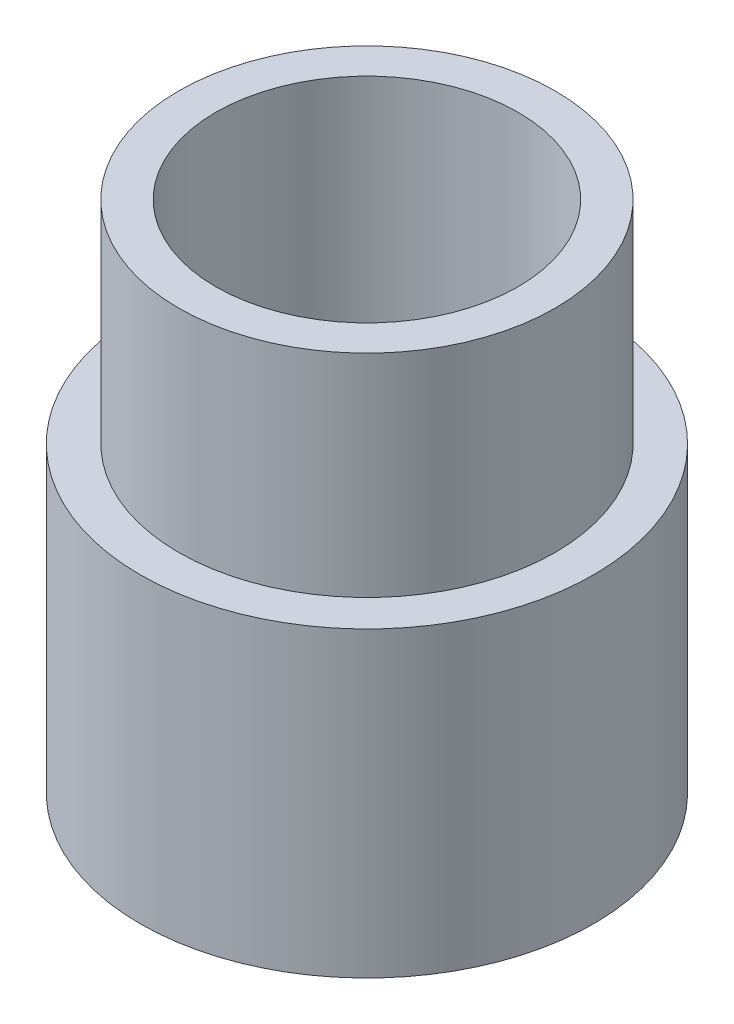
ISO-10303-21;
HEADER;
FILE_DESCRIPTION(('STEP AP214'),'2;1');
FILE_NAME('part.step','',(''),(''),'','','');
FILE_SCHEMA(('AUTOMOTIVE_DESIGN { 1 0 10303 214 1 1 1 1 }'));
ENDSEC;
DATA;
#1=APPLICATION_CONTEXT('core data for automotive mechanical design processes');
#2=APPLICATION_PROTOCOL_DEFINITION('international standard','automotive_design',2000,#1);
#3=PRODUCT_CONTEXT('',#1,'mechanical');
#4=PRODUCT('Part','Part','',(#3));
#5=PRODUCT_RELATED_PRODUCT_CATEGORY('part','',(#4));
#6=PRODUCT_DEFINITION_FORMATION('','',#4);
#7=PRODUCT_DEFINITION_CONTEXT('part definition',#1,'design');
#8=PRODUCT_DEFINITION('design','',#6,#7);
#9=PRODUCT_DEFINITION_SHAPE('','',#8);
#10=(LENGTH_UNIT() NAMED_UNIT(*) SI_UNIT(.MILLI.,.METRE.));
#11=(NAMED_UNIT(*) PLANE_ANGLE_UNIT() SI_UNIT($,.RADIAN.));
#12=(NAMED_UNIT(*) SI_UNIT($,.STERADIAN.) SOLID_ANGLE_UNIT());
#13=UNCERTAINTY_MEASURE_WITH_UNIT(LENGTH_MEASURE(1.E-05),#10,'distance_accuracy_value','');
#14=(GEOMETRIC_REPRESENTATION_CONTEXT(3) GLOBAL_UNCERTAINTY_ASSIGNED_CONTEXT((#13)) GLOBAL_UNIT_ASSIGNED_CONTEXT((#10,
#11,#12)) REPRESENTATION_CONTEXT('',''));
#15=CARTESIAN_POINT('',(0.,0.,0.));
#16=DIRECTION('',(0.,0.,1.));
#17=DIRECTION('',(1.,0.,0.));
#18=AXIS2_PLACEMENT_3D('',#15,#16,#17);
#19=CARTESIAN_POINT('',(0.,10.,0.));
#20=DIRECTION('',(0.,-1.,0.));
#21=DIRECTION('',(0.,0.,-1.));
#22=AXIS2_PLACEMENT_3D('',#19,#20,#21);
#23=CYLINDRICAL_SURFACE('',#22,7.5);
#24=CARTESIAN_POINT('',(0.,10.,0.));
#25=DIRECTION('',(0.,1.,0.));
#26=DIRECTION('',(0.,0.,1.));
#27=AXIS2_PLACEMENT_3D('',#24,#25,#26);
#28=CIRCLE('',#27,7.5);
#29=CARTESIAN_POINT('',(0.,10.,7.5));
#30=VERTEX_POINT('',#29);
#31=EDGE_CURVE('E38',#30,#30,#28,.T.);
#32=ORIENTED_EDGE('',*,*,#31,.F.);
#33=EDGE_LOOP('',(#32));
#34=FACE_BOUND('',#33,.T.);
#35=CARTESIAN_POINT('',(0.,0.,0.));
#36=DIRECTION('',(0.,1.,0.));
#37=DIRECTION('',(0.,0.,1.));
#38=AXIS2_PLACEMENT_3D('',#35,#36,#37);
#39=CIRCLE('',#38,7.5);
#40=CARTESIAN_POINT('',(0.,0.,7.5));
#41=VERTEX_POINT('',#40);
#42=EDGE_CURVE('E34',#41,#41,#39,.T.);
#43=ORIENTED_EDGE('',*,*,#42,.T.);
#44=EDGE_LOOP('',(#43));
#45=FACE_BOUND('',#44,.T.);
#46=ADVANCED_FACE('F31',(#34,#45),#23,.T.);
#47=CARTESIAN_POINT('',(0.,10.,0.));
#48=DIRECTION('',(0.,1.,0.));
#49=DIRECTION('',(0.,0.,1.));
#50=AXIS2_PLACEMENT_3D('',#47,#48,#49);
#51=PLANE('',#50);
#52=CARTESIAN_POINT('',(0.,10.,0.));
#53=DIRECTION('',(0.,1.,0.));
#54=DIRECTION('',(0.,0.,1.));
#55=AXIS2_PLACEMENT_3D('',#52,#53,#54);
#56=CIRCLE('',#55,6.225);
#57=CARTESIAN_POINT('',(0.,10.,6.225));
#58=VERTEX_POINT('',#57);
#59=EDGE_CURVE('E10',#58,#58,#56,.T.);
#60=ORIENTED_EDGE('',*,*,#59,.F.);
#61=EDGE_LOOP('',(#60));
#62=FACE_BOUND('',#61,.T.);
#63=ORIENTED_EDGE('',*,*,#31,.T.);
#64=EDGE_LOOP('',(#63));
#65=FACE_BOUND('',#64,.T.);
#66=ADVANCED_FACE('F81',(#62,#65),#51,.T.);
#67=CARTESIAN_POINT('',(0.,0.,0.));
#68=DIRECTION('',(0.,1.,0.));
#69=DIRECTION('',(0.,0.,1.));
#70=AXIS2_PLACEMENT_3D('',#67,#68,#69);
#71=PLANE('',#70);
#72=CARTESIAN_POINT('',(0.,0.,0.));
#73=DIRECTION('',(0.,-1.,0.));
#74=DIRECTION('',(0.,0.,-1.));
#75=AXIS2_PLACEMENT_3D('',#72,#73,#74);
#76=CIRCLE('',#75,6.25);
#77=CARTESIAN_POINT('',(0.,0.,-6.25));
#78=VERTEX_POINT('',#77);
#79=EDGE_CURVE('E50',#78,#78,#76,.T.);
#80=ORIENTED_EDGE('',*,*,#79,.F.);
#81=EDGE_LOOP('',(#80));
#82=FACE_BOUND('',#81,.T.);
#83=ORIENTED_EDGE('',*,*,#42,.F.);
#84=EDGE_LOOP('',(#83));
#85=FACE_BOUND('',#84,.T.);
#86=ADVANCED_FACE('F86',(#82,#85),#71,.F.);
#87=CARTESIAN_POINT('',(0.,7.5,0.));
#88=DIRECTION('',(0.,-1.,0.));
#89=DIRECTION('',(0.,0.,-1.));
#90=AXIS2_PLACEMENT_3D('',#87,#88,#89);
#91=CYLINDRICAL_SURFACE('',#90,6.25);
#92=CARTESIAN_POINT('',(0.,7.5,0.));
#93=DIRECTION('',(0.,-1.,0.));
#94=DIRECTION('',(0.,0.,-1.));
#95=AXIS2_PLACEMENT_3D('',#92,#93,#94);
#96=CIRCLE('',#95,6.25);
#97=CARTESIAN_POINT('',(0.,7.5,-6.25));
#98=VERTEX_POINT('',#97);
#99=EDGE_CURVE('E47',#98,#98,#96,.T.);
#100=ORIENTED_EDGE('',*,*,#99,.F.);
#101=EDGE_LOOP('',(#100));
#102=FACE_BOUND('',#101,.T.);
#103=ORIENTED_EDGE('',*,*,#79,.T.);
#104=EDGE_LOOP('',(#103));
#105=FACE_BOUND('',#104,.T.);
#106=ADVANCED_FACE('F95',(#102,#105),#91,.F.);
#107=CARTESIAN_POINT('',(0.,7.5,0.));
#108=DIRECTION('',(0.,-1.,0.));
#109=DIRECTION('',(0.,0.,-1.));
#110=AXIS2_PLACEMENT_3D('',#107,#108,#109);
#111=PLANE('',#110);
#112=CARTESIAN_POINT('',(0.,7.5,0.));
#113=DIRECTION('',(0.,-1.,0.));
#114=DIRECTION('',(0.,0.,-1.));
#115=AXIS2_PLACEMENT_3D('',#112,#113,#114);
#116=CIRCLE('',#115,5.);
#117=CARTESIAN_POINT('',(0.,7.5,5.));
#118=VERTEX_POINT('',#117);
#119=EDGE_CURVE('E55',#118,#118,#116,.T.);
#120=ORIENTED_EDGE('',*,*,#119,.F.);
#121=EDGE_LOOP('',(#120));
#122=FACE_BOUND('',#121,.T.);
#123=ORIENTED_EDGE('',*,*,#99,.T.);
#124=EDGE_LOOP('',(#123));
#125=FACE_BOUND('',#124,.T.);
#126=ADVANCED_FACE('F77',(#122,#125),#111,.T.);
#127=CARTESIAN_POINT('',(0.,17.,0.));
#128=DIRECTION('',(0.,-1.,0.));
#129=DIRECTION('',(0.,0.,-1.));
#130=AXIS2_PLACEMENT_3D('',#127,#128,#129);
#131=CYLINDRICAL_SURFACE('',#130,6.225);
#132=CARTESIAN_POINT('',(0.,17.,0.));
#133=DIRECTION('',(0.,1.,0.));
#134=DIRECTION('',(0.,0.,1.));
#135=AXIS2_PLACEMENT_3D('',#132,#133,#134);
#136=CIRCLE('',#135,6.225);
#137=CARTESIAN_POINT('',(0.,17.,6.225));
#138=VERTEX_POINT('',#137);
#139=EDGE_CURVE('E45',#138,#138,#136,.T.);
#140=ORIENTED_EDGE('',*,*,#139,.F.);
#141=EDGE_LOOP('',(#140));
#142=FACE_BOUND('',#141,.T.);
#143=ORIENTED_EDGE('',*,*,#59,.T.);
#144=EDGE_LOOP('',(#143));
#145=FACE_BOUND('',#144,.T.);
#146=ADVANCED_FACE('F70',(#142,#145),#131,.T.);
#147=CARTESIAN_POINT('',(0.,17.,0.));
#148=DIRECTION('',(0.,1.,0.));
#149=DIRECTION('',(0.,0.,1.));
#150=AXIS2_PLACEMENT_3D('',#147,#148,#149);
#151=PLANE('',#150);
#152=CARTESIAN_POINT('',(0.,17.,0.));
#153=DIRECTION('',(0.,1.,0.));
#154=DIRECTION('',(0.,0.,1.));
#155=AXIS2_PLACEMENT_3D('',#152,#153,#154);
#156=CIRCLE('',#155,5.);
#157=CARTESIAN_POINT('',(0.,17.,5.));
#158=VERTEX_POINT('',#157);
#159=EDGE_CURVE('E59',#158,#158,#156,.T.);
#160=ORIENTED_EDGE('',*,*,#159,.F.);
#161=EDGE_LOOP('',(#160));
#162=FACE_BOUND('',#161,.T.);
#163=ORIENTED_EDGE('',*,*,#139,.T.);
#164=EDGE_LOOP('',(#163));
#165=FACE_BOUND('',#164,.T.);
#166=ADVANCED_FACE('F68',(#162,#165),#151,.T.);
#167=CARTESIAN_POINT('',(0.,6.5,0.));
#168=DIRECTION('',(0.,1.,0.));
#169=DIRECTION('',(0.,0.,1.));
#170=AXIS2_PLACEMENT_3D('',#167,#168,#169);
#171=CYLINDRICAL_SURFACE('',#170,5.);
#172=CARTESIAN_POINT('',(0.,7.5,5.));
#173=CARTESIAN_POINT('',(0.,7.59895833333333,5.));
#174=CARTESIAN_POINT('',(0.,7.69791666666667,5.));
#175=CARTESIAN_POINT('',(0.,7.89583333333333,5.));
#176=CARTESIAN_POINT('',(0.,7.99479166666667,5.));
#177=CARTESIAN_POINT('',(0.,8.19270833333333,5.));
#178=CARTESIAN_POINT('',(0.,8.29166666666667,5.));
#179=CARTESIAN_POINT('',(0.,8.48958333333333,5.));
#180=CARTESIAN_POINT('',(0.,8.58854166666667,5.));
#181=CARTESIAN_POINT('',(0.,8.78645833333333,5.));
#182=CARTESIAN_POINT('',(0.,8.88541666666667,5.));
#183=CARTESIAN_POINT('',(0.,9.08333333333333,5.));
#184=CARTESIAN_POINT('',(0.,9.18229166666667,5.));
#185=CARTESIAN_POINT('',(0.,9.38020833333333,5.));
#186=CARTESIAN_POINT('',(0.,9.47916666666667,5.));
#187=CARTESIAN_POINT('',(0.,9.67708333333333,5.));
#188=CARTESIAN_POINT('',(0.,9.77604166666667,5.));
#189=CARTESIAN_POINT('',(0.,9.97395833333333,5.));
#190=CARTESIAN_POINT('',(0.,10.0729166666667,5.));
#191=CARTESIAN_POINT('',(0.,10.2708333333333,5.));
#192=CARTESIAN_POINT('',(0.,10.3697916666667,5.));
#193=CARTESIAN_POINT('',(0.,10.5677083333333,5.));
#194=CARTESIAN_POINT('',(0.,10.6666666666667,5.));
#195=CARTESIAN_POINT('',(0.,10.8645833333333,5.));
#196=CARTESIAN_POINT('',(0.,10.9635416666667,5.));
#197=CARTESIAN_POINT('',(0.,11.1614583333333,5.));
#198=CARTESIAN_POINT('',(0.,11.2604166666667,5.));
#199=CARTESIAN_POINT('',(0.,11.4583333333333,5.));
#200=CARTESIAN_POINT('',(0.,11.5572916666667,5.));
#201=CARTESIAN_POINT('',(0.,11.7552083333333,5.));
#202=CARTESIAN_POINT('',(0.,11.8541666666667,5.));
#203=CARTESIAN_POINT('',(0.,12.0520833333333,5.));
#204=CARTESIAN_POINT('',(0.,12.1510416666667,5.));
#205=CARTESIAN_POINT('',(0.,12.3489583333333,5.));
#206=CARTESIAN_POINT('',(0.,12.4479166666667,5.));
#207=CARTESIAN_POINT('',(0.,12.6458333333333,5.));
#208=CARTESIAN_POINT('',(0.,12.7447916666667,5.));
#209=CARTESIAN_POINT('',(0.,12.9427083333333,5.));
#210=CARTESIAN_POINT('',(0.,13.0416666666667,5.));
#211=CARTESIAN_POINT('',(0.,13.2395833333333,5.));
#212=CARTESIAN_POINT('',(0.,13.3385416666667,5.));
#213=CARTESIAN_POINT('',(0.,13.5364583333333,5.));
#214=CARTESIAN_POINT('',(0.,13.6354166666667,5.));
#215=CARTESIAN_POINT('',(0.,13.8333333333333,5.));
#216=CARTESIAN_POINT('',(0.,13.9322916666667,5.));
#217=CARTESIAN_POINT('',(0.,14.1302083333333,5.));
#218=CARTESIAN_POINT('',(0.,14.2291666666667,5.));
#219=CARTESIAN_POINT('',(0.,14.4270833333333,5.));
#220=CARTESIAN_POINT('',(0.,14.5260416666667,5.));
#221=CARTESIAN_POINT('',(0.,14.7239583333333,5.));
#222=CARTESIAN_POINT('',(0.,14.8229166666667,5.));
#223=CARTESIAN_POINT('',(0.,15.0208333333333,5.));
#224=CARTESIAN_POINT('',(0.,15.1197916666667,5.));
#225=CARTESIAN_POINT('',(0.,15.3177083333333,5.));
#226=CARTESIAN_POINT('',(0.,15.4166666666667,5.));
#227=CARTESIAN_POINT('',(0.,15.6145833333333,5.));
#228=CARTESIAN_POINT('',(0.,15.7135416666667,5.));
#229=CARTESIAN_POINT('',(0.,15.9114583333333,5.));
#230=CARTESIAN_POINT('',(0.,16.0104166666667,5.));
#231=CARTESIAN_POINT('',(0.,16.2083333333333,5.));
#232=CARTESIAN_POINT('',(0.,16.3072916666667,5.));
#233=CARTESIAN_POINT('',(0.,16.5052083333333,5.));
#234=CARTESIAN_POINT('',(0.,16.6041666666667,5.));
#235=CARTESIAN_POINT('',(0.,16.8020833333333,5.));
#236=CARTESIAN_POINT('',(0.,16.9010416666667,5.));
#237=CARTESIAN_POINT('',(0.,17.,5.));
#238=B_SPLINE_CURVE_WITH_KNOTS('',3,(#172,#173,#174,#175,#176,#177,#178,#179,#180,#181,#182,
#183,#184,#185,#186,#187,#188,#189,#190,#191,#192,#193,#194,#195,#196,#197,#198,#199,#200,#201,
#202,#203,#204,#205,#206,#207,#208,#209,#210,#211,#212,#213,#214,#215,#216,#217,#218,#219,#220,
#221,#222,#223,#224,#225,#226,#227,#228,#229,#230,#231,#232,#233,#234,#235,#236,#237),
.UNSPECIFIED.,.F.,.F.,(4,2,2,2,2,2,2,2,2,2,2,2,2,2,2,2,2,2,2,2,2,2,2,2,2,2,2,2,2,2,2,2,4),(0.,
0.296874999999999,0.59375,0.890625,1.1875,1.484375,1.78125,2.078125,2.375,2.671875,2.96875,
3.265625,3.5625,3.859375,4.15625,4.453125,4.75,5.046875,5.34375,5.640625,5.9375,6.234375,
6.53125,6.828125,7.125,7.421875,7.71875,8.015625,8.3125,8.609375,8.90625,9.203125,9.5),.UNSPECIFIED.);
#239=EDGE_CURVE('BSEAM66',#118,#158,#238,.T.);
#240=ORIENTED_EDGE('',*,*,#119,.T.);
#241=ORIENTED_EDGE('',*,*,#159,.T.);
#242=ORIENTED_EDGE('',*,*,#239,.T.);
#243=ORIENTED_EDGE('',*,*,#239,.F.);
#244=EDGE_LOOP('',(#240,#242,#241,#243));
#245=FACE_BOUND('',#244,.T.);
#246=ADVANCED_FACE('F66',(#245),#171,.F.);
#247=CLOSED_SHELL('',(#46,#66,#86,#106,#126,#146,#166,#246));
#248=MANIFOLD_SOLID_BREP('B2',#247);
#249=ADVANCED_BREP_SHAPE_REPRESENTATION('',(#18,#248),#14);
#250=SHAPE_DEFINITION_REPRESENTATION(#9,#249);
ENDSEC;
END-ISO-10303-21;
